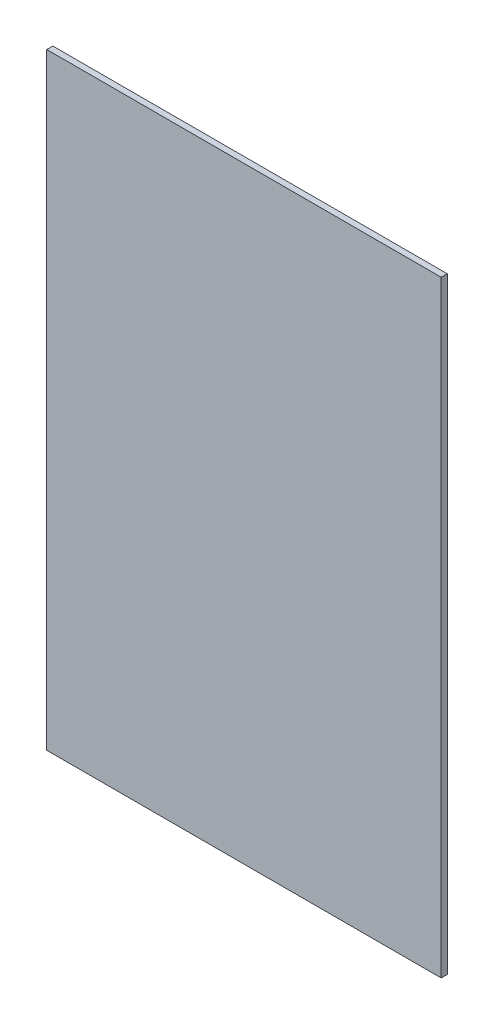
ISO-10303-21;
HEADER;
FILE_DESCRIPTION(('STEP AP214'),'2;1');
FILE_NAME('part.step','',(''),(''),'','','');
FILE_SCHEMA(('AUTOMOTIVE_DESIGN { 1 0 10303 214 1 1 1 1 }'));
ENDSEC;
DATA;
#1=APPLICATION_CONTEXT('core data for automotive mechanical design processes');
#2=APPLICATION_PROTOCOL_DEFINITION('international standard','automotive_design',2000,#1);
#3=PRODUCT_CONTEXT('',#1,'mechanical');
#4=PRODUCT('Part','Part','',(#3));
#5=PRODUCT_RELATED_PRODUCT_CATEGORY('part','',(#4));
#6=PRODUCT_DEFINITION_FORMATION('','',#4);
#7=PRODUCT_DEFINITION_CONTEXT('part definition',#1,'design');
#8=PRODUCT_DEFINITION('design','',#6,#7);
#9=PRODUCT_DEFINITION_SHAPE('','',#8);
#10=(LENGTH_UNIT() NAMED_UNIT(*) SI_UNIT(.MILLI.,.METRE.));
#11=(NAMED_UNIT(*) PLANE_ANGLE_UNIT() SI_UNIT($,.RADIAN.));
#12=(NAMED_UNIT(*) SI_UNIT($,.STERADIAN.) SOLID_ANGLE_UNIT());
#13=UNCERTAINTY_MEASURE_WITH_UNIT(LENGTH_MEASURE(1.E-05),#10,'distance_accuracy_value','');
#14=(GEOMETRIC_REPRESENTATION_CONTEXT(3) GLOBAL_UNCERTAINTY_ASSIGNED_CONTEXT((#13)) GLOBAL_UNIT_ASSIGNED_CONTEXT((#10,
#11,#12)) REPRESENTATION_CONTEXT('',''));
#15=CARTESIAN_POINT('',(0.,0.,0.));
#16=DIRECTION('',(0.,0.,1.));
#17=DIRECTION('',(1.,0.,0.));
#18=AXIS2_PLACEMENT_3D('',#15,#16,#17);
#19=CARTESIAN_POINT('',(0.,0.,10.));
#20=DIRECTION('',(0.,1.,0.));
#21=DIRECTION('',(0.,0.,1.));
#22=AXIS2_PLACEMENT_3D('',#19,#20,#21);
#23=PLANE('',#22);
#24=DIRECTION('',(1.,0.,0.));
#25=VECTOR('',#24,1.);
#26=CARTESIAN_POINT('',(0.,0.,0.));
#27=LINE('',#26,#25);
#28=CARTESIAN_POINT('',(0.,0.,0.));
#29=VERTEX_POINT('',#28);
#30=CARTESIAN_POINT('',(650.,0.,0.));
#31=VERTEX_POINT('',#30);
#32=EDGE_CURVE('E98',#29,#31,#27,.T.);
#33=ORIENTED_EDGE('',*,*,#32,.F.);
#34=DIRECTION('',(0.,0.,-1.));
#35=VECTOR('',#34,1.);
#36=CARTESIAN_POINT('',(0.,0.,10.));
#37=LINE('',#36,#35);
#38=CARTESIAN_POINT('',(0.,0.,10.));
#39=VERTEX_POINT('',#38);
#40=EDGE_CURVE('E11',#39,#29,#37,.T.);
#41=ORIENTED_EDGE('',*,*,#40,.F.);
#42=DIRECTION('',(1.,0.,0.));
#43=VECTOR('',#42,1.);
#44=CARTESIAN_POINT('',(0.,0.,10.));
#45=LINE('',#44,#43);
#46=CARTESIAN_POINT('',(650.,0.,10.));
#47=VERTEX_POINT('',#46);
#48=EDGE_CURVE('E93',#39,#47,#45,.T.);
#49=ORIENTED_EDGE('',*,*,#48,.T.);
#50=DIRECTION('',(0.,0.,-1.));
#51=VECTOR('',#50,1.);
#52=CARTESIAN_POINT('',(650.,0.,10.));
#53=LINE('',#52,#51);
#54=EDGE_CURVE('E36',#47,#31,#53,.T.);
#55=ORIENTED_EDGE('',*,*,#54,.T.);
#56=EDGE_LOOP('',(#33,#41,#49,#55));
#57=FACE_BOUND('',#56,.T.);
#58=ADVANCED_FACE('F33',(#57),#23,.T.);
#59=CARTESIAN_POINT('',(0.,0.,10.));
#60=DIRECTION('',(1.,0.,0.));
#61=DIRECTION('',(0.,1.,0.));
#62=AXIS2_PLACEMENT_3D('',#59,#60,#61);
#63=PLANE('',#62);
#64=DIRECTION('',(0.,-1.,0.));
#65=VECTOR('',#64,1.);
#66=CARTESIAN_POINT('',(0.,0.,0.));
#67=LINE('',#66,#65);
#68=CARTESIAN_POINT('',(1.22464679914735E-13,-1000.,0.));
#69=VERTEX_POINT('',#68);
#70=EDGE_CURVE('E66',#29,#69,#67,.T.);
#71=ORIENTED_EDGE('',*,*,#70,.T.);
#72=DIRECTION('',(0.,0.,-1.));
#73=VECTOR('',#72,1.);
#74=CARTESIAN_POINT('',(1.22464679914735E-13,-1000.,10.));
#75=LINE('',#74,#73);
#76=CARTESIAN_POINT('',(1.22464679914735E-13,-1000.,10.));
#77=VERTEX_POINT('',#76);
#78=EDGE_CURVE('E42',#77,#69,#75,.T.);
#79=ORIENTED_EDGE('',*,*,#78,.F.);
#80=DIRECTION('',(0.,-1.,0.));
#81=VECTOR('',#80,1.);
#82=CARTESIAN_POINT('',(0.,0.,10.));
#83=LINE('',#82,#81);
#84=EDGE_CURVE('E83',#39,#77,#83,.T.);
#85=ORIENTED_EDGE('',*,*,#84,.F.);
#86=ORIENTED_EDGE('',*,*,#40,.T.);
#87=EDGE_LOOP('',(#71,#79,#85,#86));
#88=FACE_BOUND('',#87,.T.);
#89=ADVANCED_FACE('F108',(#88),#63,.F.);
#90=CARTESIAN_POINT('',(1.22464679914735E-13,-1000.,10.));
#91=DIRECTION('',(0.,1.,0.));
#92=DIRECTION('',(0.,0.,1.));
#93=AXIS2_PLACEMENT_3D('',#90,#91,#92);
#94=PLANE('',#93);
#95=DIRECTION('',(1.,0.,0.));
#96=VECTOR('',#95,1.);
#97=CARTESIAN_POINT('',(1.22464679914735E-13,-1000.,0.));
#98=LINE('',#97,#96);
#99=CARTESIAN_POINT('',(650.,-1000.,0.));
#100=VERTEX_POINT('',#99);
#101=EDGE_CURVE('E90',#69,#100,#98,.T.);
#102=ORIENTED_EDGE('',*,*,#101,.T.);
#103=DIRECTION('',(0.,0.,-1.));
#104=VECTOR('',#103,1.);
#105=CARTESIAN_POINT('',(650.,-1000.,10.));
#106=LINE('',#105,#104);
#107=CARTESIAN_POINT('',(650.,-1000.,10.));
#108=VERTEX_POINT('',#107);
#109=EDGE_CURVE('E87',#108,#100,#106,.T.);
#110=ORIENTED_EDGE('',*,*,#109,.F.);
#111=DIRECTION('',(1.,0.,0.));
#112=VECTOR('',#111,1.);
#113=CARTESIAN_POINT('',(1.22464679914735E-13,-1000.,10.));
#114=LINE('',#113,#112);
#115=EDGE_CURVE('E78',#77,#108,#114,.T.);
#116=ORIENTED_EDGE('',*,*,#115,.F.);
#117=ORIENTED_EDGE('',*,*,#78,.T.);
#118=EDGE_LOOP('',(#102,#110,#116,#117));
#119=FACE_BOUND('',#118,.T.);
#120=ADVANCED_FACE('F88',(#119),#94,.F.);
#121=CARTESIAN_POINT('',(650.,0.,10.));
#122=DIRECTION('',(1.,0.,0.));
#123=DIRECTION('',(0.,1.,0.));
#124=AXIS2_PLACEMENT_3D('',#121,#122,#123);
#125=PLANE('',#124);
#126=DIRECTION('',(0.,-1.,0.));
#127=VECTOR('',#126,1.);
#128=CARTESIAN_POINT('',(650.,0.,0.));
#129=LINE('',#128,#127);
#130=EDGE_CURVE('E101',#31,#100,#129,.T.);
#131=ORIENTED_EDGE('',*,*,#130,.F.);
#132=ORIENTED_EDGE('',*,*,#54,.F.);
#133=DIRECTION('',(0.,-1.,0.));
#134=VECTOR('',#133,1.);
#135=CARTESIAN_POINT('',(650.,0.,10.));
#136=LINE('',#135,#134);
#137=EDGE_CURVE('E82',#47,#108,#136,.T.);
#138=ORIENTED_EDGE('',*,*,#137,.T.);
#139=ORIENTED_EDGE('',*,*,#109,.T.);
#140=EDGE_LOOP('',(#131,#132,#138,#139));
#141=FACE_BOUND('',#140,.T.);
#142=ADVANCED_FACE('F92',(#141),#125,.T.);
#143=CARTESIAN_POINT('',(0.,0.,10.));
#144=DIRECTION('',(0.,0.,-1.));
#145=DIRECTION('',(-1.,0.,0.));
#146=AXIS2_PLACEMENT_3D('',#143,#144,#145);
#147=PLANE('',#146);
#148=ORIENTED_EDGE('',*,*,#48,.F.);
#149=ORIENTED_EDGE('',*,*,#84,.T.);
#150=ORIENTED_EDGE('',*,*,#115,.T.);
#151=ORIENTED_EDGE('',*,*,#137,.F.);
#152=EDGE_LOOP('',(#148,#149,#150,#151));
#153=FACE_BOUND('',#152,.T.);
#154=ADVANCED_FACE('F81',(#153),#147,.F.);
#155=CARTESIAN_POINT('',(0.,0.,0.));
#156=DIRECTION('',(0.,0.,-1.));
#157=DIRECTION('',(-1.,0.,0.));
#158=AXIS2_PLACEMENT_3D('',#155,#156,#157);
#159=PLANE('',#158);
#160=ORIENTED_EDGE('',*,*,#32,.T.);
#161=ORIENTED_EDGE('',*,*,#130,.T.);
#162=ORIENTED_EDGE('',*,*,#101,.F.);
#163=ORIENTED_EDGE('',*,*,#70,.F.);
#164=EDGE_LOOP('',(#160,#161,#162,#163));
#165=FACE_BOUND('',#164,.T.);
#166=ADVANCED_FACE('F106',(#165),#159,.T.);
#167=CLOSED_SHELL('',(#58,#89,#120,#142,#154,#166));
#168=MANIFOLD_SOLID_BREP('B2',#167);
#169=ADVANCED_BREP_SHAPE_REPRESENTATION('',(#18,#168),#14);
#170=SHAPE_DEFINITION_REPRESENTATION(#9,#169);
ENDSEC;
END-ISO-10303-21;
